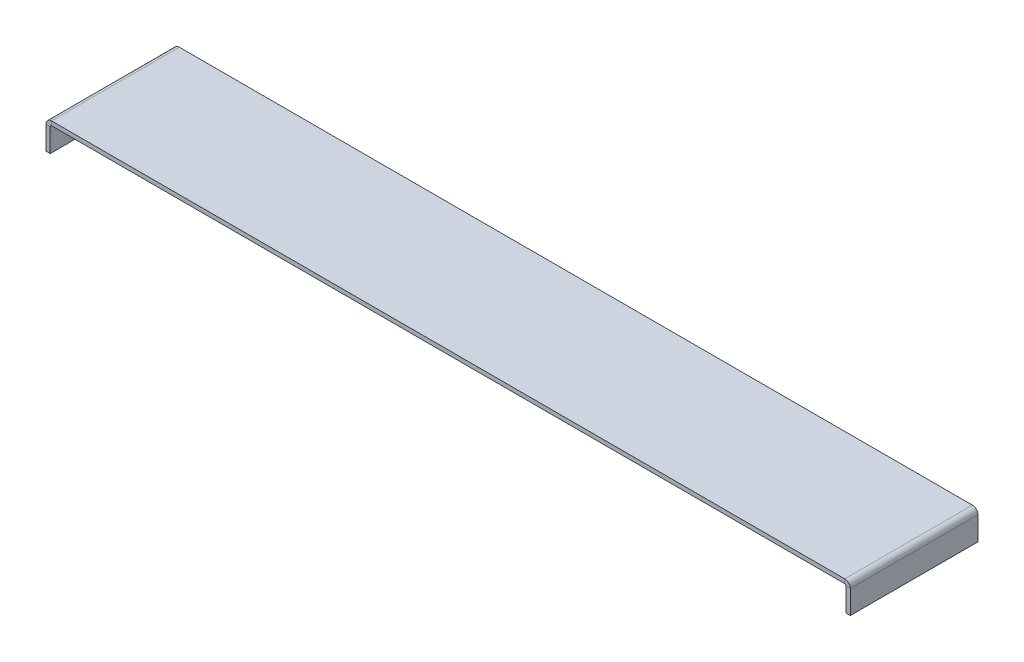
ISO-10303-21;
HEADER;
FILE_DESCRIPTION(('STEP AP214'),'2;1');
FILE_NAME('part.step','',(''),(''),'','','');
FILE_SCHEMA(('AUTOMOTIVE_DESIGN { 1 0 10303 214 1 1 1 1 }'));
ENDSEC;
DATA;
#1=APPLICATION_CONTEXT('core data for automotive mechanical design processes');
#2=APPLICATION_PROTOCOL_DEFINITION('international standard','automotive_design',2000,#1);
#3=PRODUCT_CONTEXT('',#1,'mechanical');
#4=PRODUCT('Part','Part','',(#3));
#5=PRODUCT_RELATED_PRODUCT_CATEGORY('part','',(#4));
#6=PRODUCT_DEFINITION_FORMATION('','',#4);
#7=PRODUCT_DEFINITION_CONTEXT('part definition',#1,'design');
#8=PRODUCT_DEFINITION('design','',#6,#7);
#9=PRODUCT_DEFINITION_SHAPE('','',#8);
#10=(LENGTH_UNIT() NAMED_UNIT(*) SI_UNIT(.MILLI.,.METRE.));
#11=(NAMED_UNIT(*) PLANE_ANGLE_UNIT() SI_UNIT($,.RADIAN.));
#12=(NAMED_UNIT(*) SI_UNIT($,.STERADIAN.) SOLID_ANGLE_UNIT());
#13=UNCERTAINTY_MEASURE_WITH_UNIT(LENGTH_MEASURE(1.E-05),#10,'distance_accuracy_value','');
#14=(GEOMETRIC_REPRESENTATION_CONTEXT(3) GLOBAL_UNCERTAINTY_ASSIGNED_CONTEXT((#13)) GLOBAL_UNIT_ASSIGNED_CONTEXT((#10,
#11,#12)) REPRESENTATION_CONTEXT('',''));
#15=CARTESIAN_POINT('',(0.,0.,0.));
#16=DIRECTION('',(0.,0.,1.));
#17=DIRECTION('',(1.,0.,0.));
#18=AXIS2_PLACEMENT_3D('',#15,#16,#17);
#19=CARTESIAN_POINT('',(-216.916,0.,34.925));
#20=DIRECTION('',(0.,0.,1.));
#21=DIRECTION('',(1.,0.,0.));
#22=AXIS2_PLACEMENT_3D('',#19,#20,#21);
#23=PLANE('',#22);
#24=DIRECTION('',(0.,-1.,0.));
#25=VECTOR('',#24,1.);
#26=CARTESIAN_POINT('',(-216.916,0.,34.925));
#27=LINE('',#26,#25);
#28=CARTESIAN_POINT('',(-216.916,0.,34.925));
#29=VERTEX_POINT('',#28);
#30=CARTESIAN_POINT('',(-216.916,-2.286,34.925));
#31=VERTEX_POINT('',#30);
#32=EDGE_CURVE('E11',#29,#31,#27,.T.);
#33=ORIENTED_EDGE('',*,*,#32,.F.);
#34=CARTESIAN_POINT('',(-216.916,-3.048,34.925));
#35=DIRECTION('',(0.,0.,1.));
#36=DIRECTION('',(1.,0.,0.));
#37=AXIS2_PLACEMENT_3D('',#34,#35,#36);
#38=CIRCLE('',#37,3.048);
#39=CARTESIAN_POINT('',(-219.964,-3.048,34.925));
#40=VERTEX_POINT('',#39);
#41=EDGE_CURVE('E251',#40,#29,#38,.F.);
#42=ORIENTED_EDGE('',*,*,#41,.F.);
#43=DIRECTION('',(-1.,0.,0.));
#44=VECTOR('',#43,1.);
#45=CARTESIAN_POINT('',(-217.678,-3.048,34.925));
#46=LINE('',#45,#44);
#47=CARTESIAN_POINT('',(-217.678,-3.048,34.925));
#48=VERTEX_POINT('',#47);
#49=EDGE_CURVE('E49',#48,#40,#46,.T.);
#50=ORIENTED_EDGE('',*,*,#49,.F.);
#51=CARTESIAN_POINT('',(-216.916,-3.048,34.925));
#52=DIRECTION('',(0.,0.,1.));
#53=DIRECTION('',(1.,0.,0.));
#54=AXIS2_PLACEMENT_3D('',#51,#52,#53);
#55=CIRCLE('',#54,0.762);
#56=EDGE_CURVE('E150',#48,#31,#55,.F.);
#57=ORIENTED_EDGE('',*,*,#56,.T.);
#58=EDGE_LOOP('',(#33,#42,#50,#57));
#59=FACE_BOUND('',#58,.T.);
#60=ADVANCED_FACE('F41',(#59),#23,.T.);
#61=CARTESIAN_POINT('',(-217.678,-3.048,34.925));
#62=DIRECTION('',(0.,0.,1.));
#63=DIRECTION('',(1.,0.,0.));
#64=AXIS2_PLACEMENT_3D('',#61,#62,#63);
#65=PLANE('',#64);
#66=DIRECTION('',(1.,0.,0.));
#67=VECTOR('',#66,1.);
#68=CARTESIAN_POINT('',(-219.964,0.,34.925));
#69=LINE('',#68,#67);
#70=CARTESIAN_POINT('',(216.916,0.,34.925));
#71=VERTEX_POINT('',#70);
#72=EDGE_CURVE('E144',#29,#71,#69,.T.);
#73=ORIENTED_EDGE('',*,*,#72,.F.);
#74=ORIENTED_EDGE('',*,*,#32,.T.);
#75=DIRECTION('',(1.,0.,0.));
#76=VECTOR('',#75,1.);
#77=CARTESIAN_POINT('',(-219.964,-2.286,34.925));
#78=LINE('',#77,#76);
#79=CARTESIAN_POINT('',(216.916,-2.286,34.925));
#80=VERTEX_POINT('',#79);
#81=EDGE_CURVE('E141',#31,#80,#78,.T.);
#82=ORIENTED_EDGE('',*,*,#81,.T.);
#83=DIRECTION('',(0.,1.,0.));
#84=VECTOR('',#83,1.);
#85=CARTESIAN_POINT('',(216.916,-2.286,34.925));
#86=LINE('',#85,#84);
#87=EDGE_CURVE('E232',#80,#71,#86,.T.);
#88=ORIENTED_EDGE('',*,*,#87,.T.);
#89=EDGE_LOOP('',(#73,#74,#82,#88));
#90=FACE_BOUND('',#89,.T.);
#91=ADVANCED_FACE('F139',(#90),#65,.T.);
#92=CARTESIAN_POINT('',(-219.964,-3.048,-34.925));
#93=DIRECTION('',(0.,0.,-1.));
#94=DIRECTION('',(-1.,0.,0.));
#95=AXIS2_PLACEMENT_3D('',#92,#93,#94);
#96=PLANE('',#95);
#97=DIRECTION('',(1.,0.,0.));
#98=VECTOR('',#97,1.);
#99=CARTESIAN_POINT('',(-219.964,-3.048,-34.925));
#100=LINE('',#99,#98);
#101=CARTESIAN_POINT('',(-219.964,-3.048,-34.925));
#102=VERTEX_POINT('',#101);
#103=CARTESIAN_POINT('',(-217.678,-3.048,-34.925));
#104=VERTEX_POINT('',#103);
#105=EDGE_CURVE('E237',#102,#104,#100,.T.);
#106=ORIENTED_EDGE('',*,*,#105,.F.);
#107=CARTESIAN_POINT('',(-216.916,-3.048,-34.925));
#108=DIRECTION('',(0.,0.,1.));
#109=DIRECTION('',(1.,0.,0.));
#110=AXIS2_PLACEMENT_3D('',#107,#108,#109);
#111=CIRCLE('',#110,3.048);
#112=CARTESIAN_POINT('',(-216.916,0.,-34.925));
#113=VERTEX_POINT('',#112);
#114=EDGE_CURVE('E189',#102,#113,#111,.F.);
#115=ORIENTED_EDGE('',*,*,#114,.T.);
#116=DIRECTION('',(0.,1.,0.));
#117=VECTOR('',#116,1.);
#118=CARTESIAN_POINT('',(-216.916,-2.286,-34.925));
#119=LINE('',#118,#117);
#120=CARTESIAN_POINT('',(-216.916,-2.286,-34.925));
#121=VERTEX_POINT('',#120);
#122=EDGE_CURVE('E235',#121,#113,#119,.T.);
#123=ORIENTED_EDGE('',*,*,#122,.F.);
#124=CARTESIAN_POINT('',(-216.916,-3.048,-34.925));
#125=DIRECTION('',(0.,0.,1.));
#126=DIRECTION('',(1.,0.,0.));
#127=AXIS2_PLACEMENT_3D('',#124,#125,#126);
#128=CIRCLE('',#127,0.762);
#129=EDGE_CURVE('E162',#104,#121,#128,.F.);
#130=ORIENTED_EDGE('',*,*,#129,.F.);
#131=EDGE_LOOP('',(#106,#115,#123,#130));
#132=FACE_BOUND('',#131,.T.);
#133=ADVANCED_FACE('F289',(#132),#96,.T.);
#134=CARTESIAN_POINT('',(-216.916,-2.286,-34.925));
#135=DIRECTION('',(0.,0.,-1.));
#136=DIRECTION('',(-1.,0.,0.));
#137=AXIS2_PLACEMENT_3D('',#134,#135,#136);
#138=PLANE('',#137);
#139=DIRECTION('',(0.,1.,0.));
#140=VECTOR('',#139,1.);
#141=CARTESIAN_POINT('',(-219.964,0.,-34.925));
#142=LINE('',#141,#140);
#143=CARTESIAN_POINT('',(-219.964,-15.875,-34.925));
#144=VERTEX_POINT('',#143);
#145=EDGE_CURVE('E192',#144,#102,#142,.T.);
#146=ORIENTED_EDGE('',*,*,#145,.T.);
#147=ORIENTED_EDGE('',*,*,#105,.T.);
#148=DIRECTION('',(0.,1.,0.));
#149=VECTOR('',#148,1.);
#150=CARTESIAN_POINT('',(-217.678,0.,-34.925));
#151=LINE('',#150,#149);
#152=CARTESIAN_POINT('',(-217.678,-15.875,-34.925));
#153=VERTEX_POINT('',#152);
#154=EDGE_CURVE('E198',#153,#104,#151,.T.);
#155=ORIENTED_EDGE('',*,*,#154,.F.);
#156=DIRECTION('',(-1.,0.,0.));
#157=VECTOR('',#156,1.);
#158=CARTESIAN_POINT('',(-217.678,-15.875,-34.925));
#159=LINE('',#158,#157);
#160=EDGE_CURVE('E195',#153,#144,#159,.T.);
#161=ORIENTED_EDGE('',*,*,#160,.T.);
#162=EDGE_LOOP('',(#146,#147,#155,#161));
#163=FACE_BOUND('',#162,.T.);
#164=ADVANCED_FACE('F292',(#163),#138,.T.);
#165=CARTESIAN_POINT('',(219.964,-3.048,34.925));
#166=DIRECTION('',(0.,0.,1.));
#167=DIRECTION('',(1.,0.,0.));
#168=AXIS2_PLACEMENT_3D('',#165,#166,#167);
#169=PLANE('',#168);
#170=DIRECTION('',(-1.,0.,0.));
#171=VECTOR('',#170,1.);
#172=CARTESIAN_POINT('',(219.964,-3.048,34.925));
#173=LINE('',#172,#171);
#174=CARTESIAN_POINT('',(219.964,-3.048,34.925));
#175=VERTEX_POINT('',#174);
#176=CARTESIAN_POINT('',(217.678,-3.048,34.925));
#177=VERTEX_POINT('',#176);
#178=EDGE_CURVE('E57',#175,#177,#173,.T.);
#179=ORIENTED_EDGE('',*,*,#178,.F.);
#180=CARTESIAN_POINT('',(216.916,-3.048,34.925));
#181=DIRECTION('',(0.,0.,1.));
#182=DIRECTION('',(1.,0.,0.));
#183=AXIS2_PLACEMENT_3D('',#180,#181,#182);
#184=CIRCLE('',#183,3.048);
#185=EDGE_CURVE('E261',#71,#175,#184,.F.);
#186=ORIENTED_EDGE('',*,*,#185,.F.);
#187=ORIENTED_EDGE('',*,*,#87,.F.);
#188=CARTESIAN_POINT('',(216.916,-3.048,34.925));
#189=DIRECTION('',(0.,0.,1.));
#190=DIRECTION('',(1.,0.,0.));
#191=AXIS2_PLACEMENT_3D('',#188,#189,#190);
#192=CIRCLE('',#191,0.762);
#193=EDGE_CURVE('E170',#80,#177,#192,.F.);
#194=ORIENTED_EDGE('',*,*,#193,.T.);
#195=EDGE_LOOP('',(#179,#186,#187,#194));
#196=FACE_BOUND('',#195,.T.);
#197=ADVANCED_FACE('F284',(#196),#169,.T.);
#198=CARTESIAN_POINT('',(216.916,-2.286,34.925));
#199=DIRECTION('',(0.,0.,1.));
#200=DIRECTION('',(1.,0.,0.));
#201=AXIS2_PLACEMENT_3D('',#198,#199,#200);
#202=PLANE('',#201);
#203=DIRECTION('',(0.,-1.,0.));
#204=VECTOR('',#203,1.);
#205=CARTESIAN_POINT('',(219.964,0.,34.925));
#206=LINE('',#205,#204);
#207=CARTESIAN_POINT('',(219.964,-15.875,34.925));
#208=VERTEX_POINT('',#207);
#209=EDGE_CURVE('E264',#175,#208,#206,.T.);
#210=ORIENTED_EDGE('',*,*,#209,.F.);
#211=ORIENTED_EDGE('',*,*,#178,.T.);
#212=DIRECTION('',(0.,1.,0.));
#213=VECTOR('',#212,1.);
#214=CARTESIAN_POINT('',(217.678,0.,34.925));
#215=LINE('',#214,#213);
#216=CARTESIAN_POINT('',(217.678,-15.875,34.925));
#217=VERTEX_POINT('',#216);
#218=EDGE_CURVE('E111',#177,#217,#215,.F.);
#219=ORIENTED_EDGE('',*,*,#218,.T.);
#220=DIRECTION('',(-1.,0.,0.));
#221=VECTOR('',#220,1.);
#222=CARTESIAN_POINT('',(219.964,-15.875,34.925));
#223=LINE('',#222,#221);
#224=EDGE_CURVE('E267',#208,#217,#223,.T.);
#225=ORIENTED_EDGE('',*,*,#224,.F.);
#226=EDGE_LOOP('',(#210,#211,#219,#225));
#227=FACE_BOUND('',#226,.T.);
#228=ADVANCED_FACE('F273',(#227),#202,.T.);
#229=CARTESIAN_POINT('',(216.916,0.,-34.925));
#230=DIRECTION('',(0.,0.,-1.));
#231=DIRECTION('',(-1.,0.,0.));
#232=AXIS2_PLACEMENT_3D('',#229,#230,#231);
#233=PLANE('',#232);
#234=DIRECTION('',(0.,-1.,0.));
#235=VECTOR('',#234,1.);
#236=CARTESIAN_POINT('',(216.916,0.,-34.925));
#237=LINE('',#236,#235);
#238=CARTESIAN_POINT('',(216.916,0.,-34.925));
#239=VERTEX_POINT('',#238);
#240=CARTESIAN_POINT('',(216.916,-2.286,-34.925));
#241=VERTEX_POINT('',#240);
#242=EDGE_CURVE('E98',#239,#241,#237,.T.);
#243=ORIENTED_EDGE('',*,*,#242,.F.);
#244=CARTESIAN_POINT('',(216.916,-3.048,-34.925));
#245=DIRECTION('',(0.,0.,1.));
#246=DIRECTION('',(1.,0.,0.));
#247=AXIS2_PLACEMENT_3D('',#244,#245,#246);
#248=CIRCLE('',#247,3.048);
#249=CARTESIAN_POINT('',(219.964,-3.048,-34.925));
#250=VERTEX_POINT('',#249);
#251=EDGE_CURVE('E185',#239,#250,#248,.F.);
#252=ORIENTED_EDGE('',*,*,#251,.T.);
#253=DIRECTION('',(1.,0.,0.));
#254=VECTOR('',#253,1.);
#255=CARTESIAN_POINT('',(217.678,-3.048,-34.925));
#256=LINE('',#255,#254);
#257=CARTESIAN_POINT('',(217.678,-3.048,-34.925));
#258=VERTEX_POINT('',#257);
#259=EDGE_CURVE('E105',#258,#250,#256,.T.);
#260=ORIENTED_EDGE('',*,*,#259,.F.);
#261=CARTESIAN_POINT('',(216.916,-3.048,-34.925));
#262=DIRECTION('',(0.,0.,1.));
#263=DIRECTION('',(1.,0.,0.));
#264=AXIS2_PLACEMENT_3D('',#261,#262,#263);
#265=CIRCLE('',#264,0.762);
#266=EDGE_CURVE('E204',#241,#258,#265,.F.);
#267=ORIENTED_EDGE('',*,*,#266,.F.);
#268=EDGE_LOOP('',(#243,#252,#260,#267));
#269=FACE_BOUND('',#268,.T.);
#270=ADVANCED_FACE('F321',(#269),#233,.T.);
#271=CARTESIAN_POINT('',(217.678,-3.048,-34.925));
#272=DIRECTION('',(0.,0.,-1.));
#273=DIRECTION('',(-1.,0.,0.));
#274=AXIS2_PLACEMENT_3D('',#271,#272,#273);
#275=PLANE('',#274);
#276=DIRECTION('',(1.,0.,0.));
#277=VECTOR('',#276,1.);
#278=CARTESIAN_POINT('',(-219.964,0.,-34.925));
#279=LINE('',#278,#277);
#280=EDGE_CURVE('E187',#113,#239,#279,.T.);
#281=ORIENTED_EDGE('',*,*,#280,.T.);
#282=ORIENTED_EDGE('',*,*,#242,.T.);
#283=DIRECTION('',(1.,0.,0.));
#284=VECTOR('',#283,1.);
#285=CARTESIAN_POINT('',(-219.964,-2.286,-34.925));
#286=LINE('',#285,#284);
#287=EDGE_CURVE('E202',#121,#241,#286,.T.);
#288=ORIENTED_EDGE('',*,*,#287,.F.);
#289=ORIENTED_EDGE('',*,*,#122,.T.);
#290=EDGE_LOOP('',(#281,#282,#288,#289));
#291=FACE_BOUND('',#290,.T.);
#292=ADVANCED_FACE('F324',(#291),#275,.T.);
#293=CARTESIAN_POINT('',(217.678,0.,34.925));
#294=DIRECTION('',(1.,0.,0.));
#295=DIRECTION('',(0.,0.,-1.));
#296=AXIS2_PLACEMENT_3D('',#293,#294,#295);
#297=PLANE('',#296);
#298=DIRECTION('',(0.,1.,0.));
#299=VECTOR('',#298,1.);
#300=CARTESIAN_POINT('',(217.678,0.,-34.925));
#301=LINE('',#300,#299);
#302=CARTESIAN_POINT('',(217.678,-15.875,-34.925));
#303=VERTEX_POINT('',#302);
#304=EDGE_CURVE('E176',#258,#303,#301,.F.);
#305=ORIENTED_EDGE('',*,*,#304,.T.);
#306=DIRECTION('',(0.,0.,-1.));
#307=VECTOR('',#306,1.);
#308=CARTESIAN_POINT('',(217.678,-15.875,34.925));
#309=LINE('',#308,#307);
#310=EDGE_CURVE('E228',#217,#303,#309,.T.);
#311=ORIENTED_EDGE('',*,*,#310,.F.);
#312=ORIENTED_EDGE('',*,*,#218,.F.);
#313=DIRECTION('',(0.,0.,-1.));
#314=VECTOR('',#313,1.);
#315=CARTESIAN_POINT('',(217.678,-3.048,34.925));
#316=LINE('',#315,#314);
#317=EDGE_CURVE('E172',#177,#258,#316,.T.);
#318=ORIENTED_EDGE('',*,*,#317,.T.);
#319=EDGE_LOOP('',(#305,#311,#312,#318));
#320=FACE_BOUND('',#319,.T.);
#321=ADVANCED_FACE('F327',(#320),#297,.F.);
#322=CARTESIAN_POINT('',(219.964,-15.875,34.925));
#323=DIRECTION('',(0.,-1.,0.));
#324=DIRECTION('',(0.,0.,-1.));
#325=AXIS2_PLACEMENT_3D('',#322,#323,#324);
#326=PLANE('',#325);
#327=DIRECTION('',(-1.,0.,0.));
#328=VECTOR('',#327,1.);
#329=CARTESIAN_POINT('',(219.964,-15.875,-34.925));
#330=LINE('',#329,#328);
#331=CARTESIAN_POINT('',(219.964,-15.875,-34.925));
#332=VERTEX_POINT('',#331);
#333=EDGE_CURVE('E179',#332,#303,#330,.T.);
#334=ORIENTED_EDGE('',*,*,#333,.F.);
#335=DIRECTION('',(0.,0.,-1.));
#336=VECTOR('',#335,1.);
#337=CARTESIAN_POINT('',(219.964,-15.875,34.925));
#338=LINE('',#337,#336);
#339=EDGE_CURVE('E226',#208,#332,#338,.T.);
#340=ORIENTED_EDGE('',*,*,#339,.F.);
#341=ORIENTED_EDGE('',*,*,#224,.T.);
#342=ORIENTED_EDGE('',*,*,#310,.T.);
#343=EDGE_LOOP('',(#334,#340,#341,#342));
#344=FACE_BOUND('',#343,.T.);
#345=ADVANCED_FACE('F272',(#344),#326,.T.);
#346=CARTESIAN_POINT('',(219.964,0.,34.925));
#347=DIRECTION('',(1.,0.,0.));
#348=DIRECTION('',(0.,0.,-1.));
#349=AXIS2_PLACEMENT_3D('',#346,#347,#348);
#350=PLANE('',#349);
#351=DIRECTION('',(0.,-1.,0.));
#352=VECTOR('',#351,1.);
#353=CARTESIAN_POINT('',(219.964,0.,-34.925));
#354=LINE('',#353,#352);
#355=EDGE_CURVE('E182',#250,#332,#354,.T.);
#356=ORIENTED_EDGE('',*,*,#355,.F.);
#357=DIRECTION('',(0.,0.,-1.));
#358=VECTOR('',#357,1.);
#359=CARTESIAN_POINT('',(219.964,-3.048,34.925));
#360=LINE('',#359,#358);
#361=EDGE_CURVE('E223',#175,#250,#360,.T.);
#362=ORIENTED_EDGE('',*,*,#361,.F.);
#363=ORIENTED_EDGE('',*,*,#209,.T.);
#364=ORIENTED_EDGE('',*,*,#339,.T.);
#365=EDGE_LOOP('',(#356,#362,#363,#364));
#366=FACE_BOUND('',#365,.T.);
#367=ADVANCED_FACE('F277',(#366),#350,.T.);
#368=CARTESIAN_POINT('',(216.916,-3.048,34.925));
#369=DIRECTION('',(0.,0.,-1.));
#370=DIRECTION('',(-1.,0.,0.));
#371=AXIS2_PLACEMENT_3D('',#368,#369,#370);
#372=CYLINDRICAL_SURFACE('',#371,3.048);
#373=ORIENTED_EDGE('',*,*,#251,.F.);
#374=DIRECTION('',(0.,0.,-1.));
#375=VECTOR('',#374,1.);
#376=CARTESIAN_POINT('',(216.916,0.,34.925));
#377=LINE('',#376,#375);
#378=EDGE_CURVE('E220',#71,#239,#377,.T.);
#379=ORIENTED_EDGE('',*,*,#378,.F.);
#380=ORIENTED_EDGE('',*,*,#185,.T.);
#381=ORIENTED_EDGE('',*,*,#361,.T.);
#382=EDGE_LOOP('',(#373,#379,#380,#381));
#383=FACE_BOUND('',#382,.T.);
#384=ADVANCED_FACE('F280',(#383),#372,.T.);
#385=CARTESIAN_POINT('',(-219.964,0.,34.925));
#386=DIRECTION('',(0.,1.,0.));
#387=DIRECTION('',(0.,0.,1.));
#388=AXIS2_PLACEMENT_3D('',#385,#386,#387);
#389=PLANE('',#388);
#390=ORIENTED_EDGE('',*,*,#280,.F.);
#391=DIRECTION('',(0.,0.,-1.));
#392=VECTOR('',#391,1.);
#393=CARTESIAN_POINT('',(-216.916,0.,34.925));
#394=LINE('',#393,#392);
#395=EDGE_CURVE('E217',#29,#113,#394,.T.);
#396=ORIENTED_EDGE('',*,*,#395,.F.);
#397=ORIENTED_EDGE('',*,*,#72,.T.);
#398=ORIENTED_EDGE('',*,*,#378,.T.);
#399=EDGE_LOOP('',(#390,#396,#397,#398));
#400=FACE_BOUND('',#399,.T.);
#401=ADVANCED_FACE('F287',(#400),#389,.T.);
#402=CARTESIAN_POINT('',(-216.916,-3.048,34.925));
#403=DIRECTION('',(0.,0.,-1.));
#404=DIRECTION('',(-1.,0.,0.));
#405=AXIS2_PLACEMENT_3D('',#402,#403,#404);
#406=CYLINDRICAL_SURFACE('',#405,3.048);
#407=ORIENTED_EDGE('',*,*,#114,.F.);
#408=DIRECTION('',(0.,0.,-1.));
#409=VECTOR('',#408,1.);
#410=CARTESIAN_POINT('',(-219.964,-3.048,34.925));
#411=LINE('',#410,#409);
#412=EDGE_CURVE('E214',#40,#102,#411,.T.);
#413=ORIENTED_EDGE('',*,*,#412,.F.);
#414=ORIENTED_EDGE('',*,*,#41,.T.);
#415=ORIENTED_EDGE('',*,*,#395,.T.);
#416=EDGE_LOOP('',(#407,#413,#414,#415));
#417=FACE_BOUND('',#416,.T.);
#418=ADVANCED_FACE('F250',(#417),#406,.T.);
#419=CARTESIAN_POINT('',(-219.964,0.,34.925));
#420=DIRECTION('',(-1.,0.,0.));
#421=DIRECTION('',(0.,0.,1.));
#422=AXIS2_PLACEMENT_3D('',#419,#420,#421);
#423=PLANE('',#422);
#424=ORIENTED_EDGE('',*,*,#145,.F.);
#425=DIRECTION('',(0.,0.,-1.));
#426=VECTOR('',#425,1.);
#427=CARTESIAN_POINT('',(-219.964,-15.875,34.925));
#428=LINE('',#427,#426);
#429=CARTESIAN_POINT('',(-219.964,-15.875,34.925));
#430=VERTEX_POINT('',#429);
#431=EDGE_CURVE('E212',#430,#144,#428,.T.);
#432=ORIENTED_EDGE('',*,*,#431,.F.);
#433=DIRECTION('',(0.,1.,0.));
#434=VECTOR('',#433,1.);
#435=CARTESIAN_POINT('',(-219.964,0.,34.925));
#436=LINE('',#435,#434);
#437=EDGE_CURVE('E244',#430,#40,#436,.T.);
#438=ORIENTED_EDGE('',*,*,#437,.T.);
#439=ORIENTED_EDGE('',*,*,#412,.T.);
#440=EDGE_LOOP('',(#424,#432,#438,#439));
#441=FACE_BOUND('',#440,.T.);
#442=ADVANCED_FACE('F255',(#441),#423,.T.);
#443=CARTESIAN_POINT('',(-217.678,-15.875,34.925));
#444=DIRECTION('',(0.,-1.,0.));
#445=DIRECTION('',(0.,0.,-1.));
#446=AXIS2_PLACEMENT_3D('',#443,#444,#445);
#447=PLANE('',#446);
#448=ORIENTED_EDGE('',*,*,#160,.F.);
#449=DIRECTION('',(0.,0.,-1.));
#450=VECTOR('',#449,1.);
#451=CARTESIAN_POINT('',(-217.678,-15.875,34.925));
#452=LINE('',#451,#450);
#453=CARTESIAN_POINT('',(-217.678,-15.875,34.925));
#454=VERTEX_POINT('',#453);
#455=EDGE_CURVE('E210',#454,#153,#452,.T.);
#456=ORIENTED_EDGE('',*,*,#455,.F.);
#457=DIRECTION('',(-1.,0.,0.));
#458=VECTOR('',#457,1.);
#459=CARTESIAN_POINT('',(-217.678,-15.875,34.925));
#460=LINE('',#459,#458);
#461=EDGE_CURVE('E256',#454,#430,#460,.T.);
#462=ORIENTED_EDGE('',*,*,#461,.T.);
#463=ORIENTED_EDGE('',*,*,#431,.T.);
#464=EDGE_LOOP('',(#448,#456,#462,#463));
#465=FACE_BOUND('',#464,.T.);
#466=ADVANCED_FACE('F297',(#465),#447,.T.);
#467=CARTESIAN_POINT('',(-217.678,0.,34.925));
#468=DIRECTION('',(-1.,0.,0.));
#469=DIRECTION('',(0.,0.,1.));
#470=AXIS2_PLACEMENT_3D('',#467,#468,#469);
#471=PLANE('',#470);
#472=ORIENTED_EDGE('',*,*,#154,.T.);
#473=DIRECTION('',(0.,0.,-1.));
#474=VECTOR('',#473,1.);
#475=CARTESIAN_POINT('',(-217.678,-3.048,34.925));
#476=LINE('',#475,#474);
#477=EDGE_CURVE('E164',#48,#104,#476,.T.);
#478=ORIENTED_EDGE('',*,*,#477,.F.);
#479=DIRECTION('',(0.,1.,0.));
#480=VECTOR('',#479,1.);
#481=CARTESIAN_POINT('',(-217.678,0.,34.925));
#482=LINE('',#481,#480);
#483=EDGE_CURVE('E155',#454,#48,#482,.T.);
#484=ORIENTED_EDGE('',*,*,#483,.F.);
#485=ORIENTED_EDGE('',*,*,#455,.T.);
#486=EDGE_LOOP('',(#472,#478,#484,#485));
#487=FACE_BOUND('',#486,.T.);
#488=ADVANCED_FACE('F295',(#487),#471,.F.);
#489=CARTESIAN_POINT('',(-216.916,-3.048,34.925));
#490=DIRECTION('',(0.,0.,-1.));
#491=DIRECTION('',(-1.,0.,0.));
#492=AXIS2_PLACEMENT_3D('',#489,#490,#491);
#493=CYLINDRICAL_SURFACE('',#492,0.762);
#494=ORIENTED_EDGE('',*,*,#129,.T.);
#495=DIRECTION('',(0.,0.,-1.));
#496=VECTOR('',#495,1.);
#497=CARTESIAN_POINT('',(-216.916,-2.286,34.925));
#498=LINE('',#497,#496);
#499=EDGE_CURVE('E159',#31,#121,#498,.T.);
#500=ORIENTED_EDGE('',*,*,#499,.F.);
#501=ORIENTED_EDGE('',*,*,#56,.F.);
#502=ORIENTED_EDGE('',*,*,#477,.T.);
#503=EDGE_LOOP('',(#494,#500,#501,#502));
#504=FACE_BOUND('',#503,.T.);
#505=ADVANCED_FACE('F160',(#504),#493,.F.);
#506=CARTESIAN_POINT('',(-219.964,-2.286,34.925));
#507=DIRECTION('',(0.,1.,0.));
#508=DIRECTION('',(0.,0.,1.));
#509=AXIS2_PLACEMENT_3D('',#506,#507,#508);
#510=PLANE('',#509);
#511=ORIENTED_EDGE('',*,*,#287,.T.);
#512=DIRECTION('',(0.,0.,-1.));
#513=VECTOR('',#512,1.);
#514=CARTESIAN_POINT('',(216.916,-2.286,34.925));
#515=LINE('',#514,#513);
#516=EDGE_CURVE('E165',#80,#241,#515,.T.);
#517=ORIENTED_EDGE('',*,*,#516,.F.);
#518=ORIENTED_EDGE('',*,*,#81,.F.);
#519=ORIENTED_EDGE('',*,*,#499,.T.);
#520=EDGE_LOOP('',(#511,#517,#518,#519));
#521=FACE_BOUND('',#520,.T.);
#522=ADVANCED_FACE('F167',(#521),#510,.F.);
#523=CARTESIAN_POINT('',(216.916,-3.048,34.925));
#524=DIRECTION('',(0.,0.,-1.));
#525=DIRECTION('',(-1.,0.,0.));
#526=AXIS2_PLACEMENT_3D('',#523,#524,#525);
#527=CYLINDRICAL_SURFACE('',#526,0.762);
#528=ORIENTED_EDGE('',*,*,#266,.T.);
#529=ORIENTED_EDGE('',*,*,#317,.F.);
#530=ORIENTED_EDGE('',*,*,#193,.F.);
#531=ORIENTED_EDGE('',*,*,#516,.T.);
#532=EDGE_LOOP('',(#528,#529,#530,#531));
#533=FACE_BOUND('',#532,.T.);
#534=ADVANCED_FACE('F379',(#533),#527,.F.);
#535=CARTESIAN_POINT('',(216.916,-3.048,34.925));
#536=DIRECTION('',(0.,0.,1.));
#537=DIRECTION('',(1.,0.,0.));
#538=AXIS2_PLACEMENT_3D('',#535,#536,#537);
#539=PLANE('',#538);
#540=ORIENTED_EDGE('',*,*,#483,.T.);
#541=ORIENTED_EDGE('',*,*,#49,.T.);
#542=ORIENTED_EDGE('',*,*,#437,.F.);
#543=ORIENTED_EDGE('',*,*,#461,.F.);
#544=EDGE_LOOP('',(#540,#541,#542,#543));
#545=FACE_BOUND('',#544,.T.);
#546=ADVANCED_FACE('F241',(#545),#539,.T.);
#547=CARTESIAN_POINT('',(216.916,-3.048,-34.925));
#548=DIRECTION('',(0.,0.,1.));
#549=DIRECTION('',(1.,0.,0.));
#550=AXIS2_PLACEMENT_3D('',#547,#548,#549);
#551=PLANE('',#550);
#552=ORIENTED_EDGE('',*,*,#304,.F.);
#553=ORIENTED_EDGE('',*,*,#259,.T.);
#554=ORIENTED_EDGE('',*,*,#355,.T.);
#555=ORIENTED_EDGE('',*,*,#333,.T.);
#556=EDGE_LOOP('',(#552,#553,#554,#555));
#557=FACE_BOUND('',#556,.T.);
#558=ADVANCED_FACE('F399',(#557),#551,.F.);
#559=CLOSED_SHELL('',(#60,#91,#133,#164,#197,#228,#270,#292,#321,#345,#367,#384,#401,#418,#442,
#466,#488,#505,#522,#534,#546,#558));
#560=MANIFOLD_SOLID_BREP('B2',#559);
#561=ADVANCED_BREP_SHAPE_REPRESENTATION('',(#18,#560),#14);
#562=SHAPE_DEFINITION_REPRESENTATION(#9,#561);
ENDSEC;
END-ISO-10303-21;
